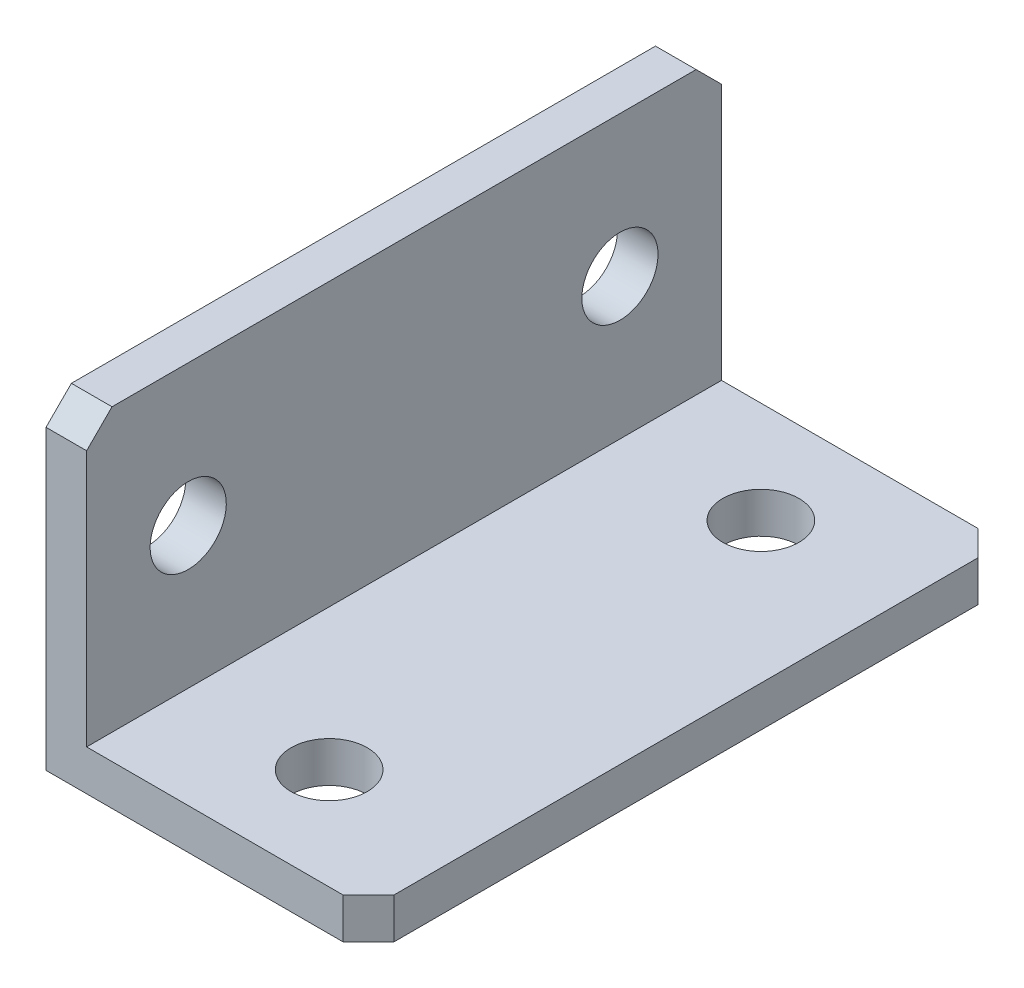
ISO-10303-21;
HEADER;
FILE_DESCRIPTION(('STEP AP214'),'2;1');
FILE_NAME('part.step','',(''),(''),'','','');
FILE_SCHEMA(('AUTOMOTIVE_DESIGN { 1 0 10303 214 1 1 1 1 }'));
ENDSEC;
DATA;
#1=APPLICATION_CONTEXT('core data for automotive mechanical design processes');
#2=APPLICATION_PROTOCOL_DEFINITION('international standard','automotive_design',2000,#1);
#3=PRODUCT_CONTEXT('',#1,'mechanical');
#4=PRODUCT('Part','Part','',(#3));
#5=PRODUCT_RELATED_PRODUCT_CATEGORY('part','',(#4));
#6=PRODUCT_DEFINITION_FORMATION('','',#4);
#7=PRODUCT_DEFINITION_CONTEXT('part definition',#1,'design');
#8=PRODUCT_DEFINITION('design','',#6,#7);
#9=PRODUCT_DEFINITION_SHAPE('','',#8);
#10=(LENGTH_UNIT() NAMED_UNIT(*) SI_UNIT(.MILLI.,.METRE.));
#11=(NAMED_UNIT(*) PLANE_ANGLE_UNIT() SI_UNIT($,.RADIAN.));
#12=(NAMED_UNIT(*) SI_UNIT($,.STERADIAN.) SOLID_ANGLE_UNIT());
#13=UNCERTAINTY_MEASURE_WITH_UNIT(LENGTH_MEASURE(1.E-05),#10,'distance_accuracy_value','');
#14=(GEOMETRIC_REPRESENTATION_CONTEXT(3) GLOBAL_UNCERTAINTY_ASSIGNED_CONTEXT((#13)) GLOBAL_UNIT_ASSIGNED_CONTEXT((#10,
#11,#12)) REPRESENTATION_CONTEXT('',''));
#15=CARTESIAN_POINT('',(0.,0.,0.));
#16=DIRECTION('',(0.,0.,1.));
#17=DIRECTION('',(1.,0.,0.));
#18=AXIS2_PLACEMENT_3D('',#15,#16,#17);
#19=CARTESIAN_POINT('',(22.2,0.,50.));
#20=DIRECTION('',(0.,-1.,0.));
#21=DIRECTION('',(1.,0.,0.));
#22=AXIS2_PLACEMENT_3D('',#19,#20,#21);
#23=PLANE('',#22);
#24=CARTESIAN_POINT('',(11.1,0.,8.));
#25=DIRECTION('',(0.,1.,0.));
#26=DIRECTION('',(-1.,0.,0.));
#27=AXIS2_PLACEMENT_3D('',#24,#25,#26);
#28=CIRCLE('',#27,3.);
#29=CARTESIAN_POINT('',(8.1,0.,8.));
#30=VERTEX_POINT('',#29);
#31=EDGE_CURVE('E333',#30,#30,#28,.T.);
#32=ORIENTED_EDGE('',*,*,#31,.F.);
#33=EDGE_LOOP('',(#32));
#34=FACE_BOUND('',#33,.T.);
#35=CARTESIAN_POINT('',(11.1,0.,42.));
#36=DIRECTION('',(0.,1.,0.));
#37=DIRECTION('',(-1.,0.,0.));
#38=AXIS2_PLACEMENT_3D('',#35,#36,#37);
#39=CIRCLE('',#38,3.);
#40=CARTESIAN_POINT('',(8.1,0.,42.));
#41=VERTEX_POINT('',#40);
#42=EDGE_CURVE('E337',#41,#41,#39,.T.);
#43=ORIENTED_EDGE('',*,*,#42,.F.);
#44=EDGE_LOOP('',(#43));
#45=FACE_BOUND('',#44,.T.);
#46=DIRECTION('',(0.,0.,-1.));
#47=VECTOR('',#46,1.);
#48=CARTESIAN_POINT('',(22.2,0.,50.));
#49=LINE('',#48,#47);
#50=CARTESIAN_POINT('',(22.2,0.,48.));
#51=VERTEX_POINT('',#50);
#52=CARTESIAN_POINT('',(22.2,0.,2.00000000000001));
#53=VERTEX_POINT('',#52);
#54=EDGE_CURVE('E214',#51,#53,#49,.T.);
#55=ORIENTED_EDGE('',*,*,#54,.T.);
#56=DIRECTION('',(-0.707106781186548,0.,-0.707106781186548));
#57=VECTOR('',#56,1.);
#58=CARTESIAN_POINT('',(22.2,0.,2.00000000000001));
#59=LINE('',#58,#57);
#60=CARTESIAN_POINT('',(20.2,0.,0.));
#61=VERTEX_POINT('',#60);
#62=EDGE_CURVE('E201',#53,#61,#59,.T.);
#63=ORIENTED_EDGE('',*,*,#62,.T.);
#64=DIRECTION('',(-1.,0.,0.));
#65=VECTOR('',#64,1.);
#66=CARTESIAN_POINT('',(22.2,0.,0.));
#67=LINE('',#66,#65);
#68=CARTESIAN_POINT('',(0.,0.,0.));
#69=VERTEX_POINT('',#68);
#70=EDGE_CURVE('E152',#61,#69,#67,.T.);
#71=ORIENTED_EDGE('',*,*,#70,.T.);
#72=DIRECTION('',(0.,0.,-1.));
#73=VECTOR('',#72,1.);
#74=CARTESIAN_POINT('',(0.,0.,50.));
#75=LINE('',#74,#73);
#76=CARTESIAN_POINT('',(0.,0.,50.));
#77=VERTEX_POINT('',#76);
#78=EDGE_CURVE('E143',#77,#69,#75,.T.);
#79=ORIENTED_EDGE('',*,*,#78,.F.);
#80=DIRECTION('',(-1.,0.,0.));
#81=VECTOR('',#80,1.);
#82=CARTESIAN_POINT('',(22.2,0.,50.));
#83=LINE('',#82,#81);
#84=CARTESIAN_POINT('',(20.2,0.,50.));
#85=VERTEX_POINT('',#84);
#86=EDGE_CURVE('E125',#85,#77,#83,.T.);
#87=ORIENTED_EDGE('',*,*,#86,.F.);
#88=DIRECTION('',(-0.707106781186548,0.,0.707106781186548));
#89=VECTOR('',#88,1.);
#90=CARTESIAN_POINT('',(20.2,0.,50.));
#91=LINE('',#90,#89);
#92=EDGE_CURVE('E198',#85,#51,#91,.F.);
#93=ORIENTED_EDGE('',*,*,#92,.T.);
#94=EDGE_LOOP('',(#55,#63,#71,#79,#87,#93));
#95=FACE_BOUND('',#94,.T.);
#96=ADVANCED_FACE('F45',(#34,#45,#95),#23,.F.);
#97=CARTESIAN_POINT('',(0.,0.,50.));
#98=DIRECTION('',(-1.,0.,0.));
#99=DIRECTION('',(0.,-1.,0.));
#100=AXIS2_PLACEMENT_3D('',#97,#98,#99);
#101=PLANE('',#100);
#102=CARTESIAN_POINT('',(0.,11.1,42.));
#103=DIRECTION('',(1.,0.,0.));
#104=DIRECTION('',(0.,1.,0.));
#105=AXIS2_PLACEMENT_3D('',#102,#103,#104);
#106=CIRCLE('',#105,3.);
#107=CARTESIAN_POINT('',(0.,14.1,42.));
#108=VERTEX_POINT('',#107);
#109=EDGE_CURVE('E315',#108,#108,#106,.T.);
#110=ORIENTED_EDGE('',*,*,#109,.F.);
#111=EDGE_LOOP('',(#110));
#112=FACE_BOUND('',#111,.T.);
#113=CARTESIAN_POINT('',(0.,11.1,8.));
#114=DIRECTION('',(1.,0.,0.));
#115=DIRECTION('',(0.,1.,0.));
#116=AXIS2_PLACEMENT_3D('',#113,#114,#115);
#117=CIRCLE('',#116,3.);
#118=CARTESIAN_POINT('',(0.,14.1,8.));
#119=VERTEX_POINT('',#118);
#120=EDGE_CURVE('E317',#119,#119,#117,.T.);
#121=ORIENTED_EDGE('',*,*,#120,.F.);
#122=EDGE_LOOP('',(#121));
#123=FACE_BOUND('',#122,.T.);
#124=DIRECTION('',(0.,1.,0.));
#125=VECTOR('',#124,1.);
#126=CARTESIAN_POINT('',(0.,0.,0.));
#127=LINE('',#126,#125);
#128=CARTESIAN_POINT('',(0.,20.2,0.));
#129=VERTEX_POINT('',#128);
#130=EDGE_CURVE('E244',#69,#129,#127,.T.);
#131=ORIENTED_EDGE('',*,*,#130,.T.);
#132=DIRECTION('',(0.,0.707106781186548,0.707106781186548));
#133=VECTOR('',#132,1.);
#134=CARTESIAN_POINT('',(0.,22.2,2.00000000000001));
#135=LINE('',#134,#133);
#136=CARTESIAN_POINT('',(0.,22.2,2.00000000000001));
#137=VERTEX_POINT('',#136);
#138=EDGE_CURVE('E184',#129,#137,#135,.T.);
#139=ORIENTED_EDGE('',*,*,#138,.T.);
#140=DIRECTION('',(0.,0.,-1.));
#141=VECTOR('',#140,1.);
#142=CARTESIAN_POINT('',(0.,22.2,50.));
#143=LINE('',#142,#141);
#144=CARTESIAN_POINT('',(0.,22.2,48.));
#145=VERTEX_POINT('',#144);
#146=EDGE_CURVE('E156',#145,#137,#143,.T.);
#147=ORIENTED_EDGE('',*,*,#146,.F.);
#148=DIRECTION('',(0.,0.707106781186548,-0.707106781186548));
#149=VECTOR('',#148,1.);
#150=CARTESIAN_POINT('',(0.,20.2,50.));
#151=LINE('',#150,#149);
#152=CARTESIAN_POINT('',(0.,20.2,50.));
#153=VERTEX_POINT('',#152);
#154=EDGE_CURVE('E146',#145,#153,#151,.F.);
#155=ORIENTED_EDGE('',*,*,#154,.T.);
#156=DIRECTION('',(0.,1.,0.));
#157=VECTOR('',#156,1.);
#158=CARTESIAN_POINT('',(0.,0.,50.));
#159=LINE('',#158,#157);
#160=EDGE_CURVE('E129',#77,#153,#159,.T.);
#161=ORIENTED_EDGE('',*,*,#160,.F.);
#162=ORIENTED_EDGE('',*,*,#78,.T.);
#163=EDGE_LOOP('',(#131,#139,#147,#155,#161,#162));
#164=FACE_BOUND('',#163,.T.);
#165=ADVANCED_FACE('F142',(#112,#123,#164),#101,.F.);
#166=CARTESIAN_POINT('',(0.,22.2,50.));
#167=DIRECTION('',(0.,-1.,0.));
#168=DIRECTION('',(0.,0.,-1.));
#169=AXIS2_PLACEMENT_3D('',#166,#167,#168);
#170=PLANE('',#169);
#171=ORIENTED_EDGE('',*,*,#146,.T.);
#172=DIRECTION('',(-1.,0.,0.));
#173=VECTOR('',#172,1.);
#174=CARTESIAN_POINT('',(-3.2,22.2,2.00000000000001));
#175=LINE('',#174,#173);
#176=CARTESIAN_POINT('',(-3.2,22.2,2.00000000000001));
#177=VERTEX_POINT('',#176);
#178=EDGE_CURVE('E160',#137,#177,#175,.T.);
#179=ORIENTED_EDGE('',*,*,#178,.T.);
#180=DIRECTION('',(0.,0.,-1.));
#181=VECTOR('',#180,1.);
#182=CARTESIAN_POINT('',(-3.2,22.2,50.));
#183=LINE('',#182,#181);
#184=CARTESIAN_POINT('',(-3.2,22.2,48.));
#185=VERTEX_POINT('',#184);
#186=EDGE_CURVE('E163',#185,#177,#183,.T.);
#187=ORIENTED_EDGE('',*,*,#186,.F.);
#188=DIRECTION('',(1.,0.,0.));
#189=VECTOR('',#188,1.);
#190=CARTESIAN_POINT('',(0.,22.2,48.));
#191=LINE('',#190,#189);
#192=EDGE_CURVE('E155',#185,#145,#191,.T.);
#193=ORIENTED_EDGE('',*,*,#192,.T.);
#194=EDGE_LOOP('',(#171,#179,#187,#193));
#195=FACE_BOUND('',#194,.T.);
#196=ADVANCED_FACE('F235',(#195),#170,.F.);
#197=CARTESIAN_POINT('',(-3.2,22.2,50.));
#198=DIRECTION('',(1.,0.,0.));
#199=DIRECTION('',(0.,1.,0.));
#200=AXIS2_PLACEMENT_3D('',#197,#198,#199);
#201=PLANE('',#200);
#202=CARTESIAN_POINT('',(-3.2,11.1,42.));
#203=DIRECTION('',(1.,0.,0.));
#204=DIRECTION('',(0.,1.,0.));
#205=AXIS2_PLACEMENT_3D('',#202,#203,#204);
#206=CIRCLE('',#205,3.);
#207=CARTESIAN_POINT('',(-3.2,14.1,42.));
#208=VERTEX_POINT('',#207);
#209=EDGE_CURVE('E312',#208,#208,#206,.T.);
#210=ORIENTED_EDGE('',*,*,#209,.T.);
#211=EDGE_LOOP('',(#210));
#212=FACE_BOUND('',#211,.T.);
#213=CARTESIAN_POINT('',(-3.2,11.1,8.));
#214=DIRECTION('',(1.,0.,0.));
#215=DIRECTION('',(0.,1.,0.));
#216=AXIS2_PLACEMENT_3D('',#213,#214,#215);
#217=CIRCLE('',#216,3.);
#218=CARTESIAN_POINT('',(-3.2,14.1,8.));
#219=VERTEX_POINT('',#218);
#220=EDGE_CURVE('E324',#219,#219,#217,.T.);
#221=ORIENTED_EDGE('',*,*,#220,.T.);
#222=EDGE_LOOP('',(#221));
#223=FACE_BOUND('',#222,.T.);
#224=ORIENTED_EDGE('',*,*,#186,.T.);
#225=DIRECTION('',(0.,-0.707106781186548,-0.707106781186548));
#226=VECTOR('',#225,1.);
#227=CARTESIAN_POINT('',(-3.2,22.2,2.00000000000001));
#228=LINE('',#227,#226);
#229=CARTESIAN_POINT('',(-3.2,20.2,0.));
#230=VERTEX_POINT('',#229);
#231=EDGE_CURVE('E173',#177,#230,#228,.T.);
#232=ORIENTED_EDGE('',*,*,#231,.T.);
#233=DIRECTION('',(0.,-1.,0.));
#234=VECTOR('',#233,1.);
#235=CARTESIAN_POINT('',(-3.2,22.2,0.));
#236=LINE('',#235,#234);
#237=CARTESIAN_POINT('',(-3.2,-3.2,0.));
#238=VERTEX_POINT('',#237);
#239=EDGE_CURVE('E247',#230,#238,#236,.T.);
#240=ORIENTED_EDGE('',*,*,#239,.T.);
#241=DIRECTION('',(0.,0.,-1.));
#242=VECTOR('',#241,1.);
#243=CARTESIAN_POINT('',(-3.2,-3.2,50.));
#244=LINE('',#243,#242);
#245=CARTESIAN_POINT('',(-3.2,-3.2,50.));
#246=VERTEX_POINT('',#245);
#247=EDGE_CURVE('E221',#246,#238,#244,.T.);
#248=ORIENTED_EDGE('',*,*,#247,.F.);
#249=DIRECTION('',(0.,-1.,0.));
#250=VECTOR('',#249,1.);
#251=CARTESIAN_POINT('',(-3.2,22.2,50.));
#252=LINE('',#251,#250);
#253=CARTESIAN_POINT('',(-3.2,20.2,50.));
#254=VERTEX_POINT('',#253);
#255=EDGE_CURVE('E148',#254,#246,#252,.T.);
#256=ORIENTED_EDGE('',*,*,#255,.F.);
#257=DIRECTION('',(0.,-0.707106781186548,0.707106781186548));
#258=VECTOR('',#257,1.);
#259=CARTESIAN_POINT('',(-3.2,20.2,50.));
#260=LINE('',#259,#258);
#261=EDGE_CURVE('E170',#254,#185,#260,.F.);
#262=ORIENTED_EDGE('',*,*,#261,.T.);
#263=EDGE_LOOP('',(#224,#232,#240,#248,#256,#262));
#264=FACE_BOUND('',#263,.T.);
#265=ADVANCED_FACE('F231',(#212,#223,#264),#201,.F.);
#266=CARTESIAN_POINT('',(-3.2,-3.2,50.));
#267=DIRECTION('',(0.,1.,0.));
#268=DIRECTION('',(-1.,0.,0.));
#269=AXIS2_PLACEMENT_3D('',#266,#267,#268);
#270=PLANE('',#269);
#271=CARTESIAN_POINT('',(11.1,-3.2,8.));
#272=DIRECTION('',(0.,1.,0.));
#273=DIRECTION('',(-1.,0.,0.));
#274=AXIS2_PLACEMENT_3D('',#271,#272,#273);
#275=CIRCLE('',#274,3.);
#276=CARTESIAN_POINT('',(8.1,-3.2,8.));
#277=VERTEX_POINT('',#276);
#278=EDGE_CURVE('E245',#277,#277,#275,.T.);
#279=ORIENTED_EDGE('',*,*,#278,.T.);
#280=EDGE_LOOP('',(#279));
#281=FACE_BOUND('',#280,.T.);
#282=CARTESIAN_POINT('',(11.1,-3.2,42.));
#283=DIRECTION('',(0.,1.,0.));
#284=DIRECTION('',(-1.,0.,0.));
#285=AXIS2_PLACEMENT_3D('',#282,#283,#284);
#286=CIRCLE('',#285,3.);
#287=CARTESIAN_POINT('',(8.1,-3.2,42.));
#288=VERTEX_POINT('',#287);
#289=EDGE_CURVE('E321',#288,#288,#286,.T.);
#290=ORIENTED_EDGE('',*,*,#289,.T.);
#291=EDGE_LOOP('',(#290));
#292=FACE_BOUND('',#291,.T.);
#293=DIRECTION('',(1.,0.,0.));
#294=VECTOR('',#293,1.);
#295=CARTESIAN_POINT('',(-3.2,-3.2,0.));
#296=LINE('',#295,#294);
#297=CARTESIAN_POINT('',(20.2,-3.2,0.));
#298=VERTEX_POINT('',#297);
#299=EDGE_CURVE('E137',#238,#298,#296,.T.);
#300=ORIENTED_EDGE('',*,*,#299,.T.);
#301=DIRECTION('',(0.707106781186548,0.,0.707106781186548));
#302=VECTOR('',#301,1.);
#303=CARTESIAN_POINT('',(22.2,-3.2,2.00000000000001));
#304=LINE('',#303,#302);
#305=CARTESIAN_POINT('',(22.2,-3.2,2.00000000000001));
#306=VERTEX_POINT('',#305);
#307=EDGE_CURVE('E11',#298,#306,#304,.T.);
#308=ORIENTED_EDGE('',*,*,#307,.T.);
#309=DIRECTION('',(0.,0.,-1.));
#310=VECTOR('',#309,1.);
#311=CARTESIAN_POINT('',(22.2,-3.2,50.));
#312=LINE('',#311,#310);
#313=CARTESIAN_POINT('',(22.2,-3.2,48.));
#314=VERTEX_POINT('',#313);
#315=EDGE_CURVE('E209',#314,#306,#312,.T.);
#316=ORIENTED_EDGE('',*,*,#315,.F.);
#317=DIRECTION('',(0.707106781186548,0.,-0.707106781186548));
#318=VECTOR('',#317,1.);
#319=CARTESIAN_POINT('',(20.2,-3.2,50.));
#320=LINE('',#319,#318);
#321=CARTESIAN_POINT('',(20.2,-3.2,50.));
#322=VERTEX_POINT('',#321);
#323=EDGE_CURVE('E55',#314,#322,#320,.F.);
#324=ORIENTED_EDGE('',*,*,#323,.T.);
#325=DIRECTION('',(1.,0.,0.));
#326=VECTOR('',#325,1.);
#327=CARTESIAN_POINT('',(-3.2,-3.2,50.));
#328=LINE('',#327,#326);
#329=EDGE_CURVE('E208',#246,#322,#328,.T.);
#330=ORIENTED_EDGE('',*,*,#329,.F.);
#331=ORIENTED_EDGE('',*,*,#247,.T.);
#332=EDGE_LOOP('',(#300,#308,#316,#324,#330,#331));
#333=FACE_BOUND('',#332,.T.);
#334=ADVANCED_FACE('F206',(#281,#292,#333),#270,.F.);
#335=CARTESIAN_POINT('',(22.2,-3.2,50.));
#336=DIRECTION('',(-1.,0.,0.));
#337=DIRECTION('',(0.,0.,1.));
#338=AXIS2_PLACEMENT_3D('',#335,#336,#337);
#339=PLANE('',#338);
#340=ORIENTED_EDGE('',*,*,#315,.T.);
#341=DIRECTION('',(0.,1.,0.));
#342=VECTOR('',#341,1.);
#343=CARTESIAN_POINT('',(22.2,0.,2.00000000000001));
#344=LINE('',#343,#342);
#345=EDGE_CURVE('E194',#306,#53,#344,.T.);
#346=ORIENTED_EDGE('',*,*,#345,.T.);
#347=ORIENTED_EDGE('',*,*,#54,.F.);
#348=DIRECTION('',(0.,-1.,0.));
#349=VECTOR('',#348,1.);
#350=CARTESIAN_POINT('',(22.2,-3.2,48.));
#351=LINE('',#350,#349);
#352=EDGE_CURVE('E67',#51,#314,#351,.T.);
#353=ORIENTED_EDGE('',*,*,#352,.T.);
#354=EDGE_LOOP('',(#340,#346,#347,#353));
#355=FACE_BOUND('',#354,.T.);
#356=ADVANCED_FACE('F216',(#355),#339,.F.);
#357=CARTESIAN_POINT('',(0.,0.,50.));
#358=DIRECTION('',(0.,0.,-1.));
#359=DIRECTION('',(-1.,0.,0.));
#360=AXIS2_PLACEMENT_3D('',#357,#358,#359);
#361=PLANE('',#360);
#362=ORIENTED_EDGE('',*,*,#160,.T.);
#363=DIRECTION('',(-1.,0.,0.));
#364=VECTOR('',#363,1.);
#365=CARTESIAN_POINT('',(0.,20.2,50.));
#366=LINE('',#365,#364);
#367=EDGE_CURVE('E189',#153,#254,#366,.T.);
#368=ORIENTED_EDGE('',*,*,#367,.T.);
#369=ORIENTED_EDGE('',*,*,#255,.T.);
#370=ORIENTED_EDGE('',*,*,#329,.T.);
#371=DIRECTION('',(0.,1.,0.));
#372=VECTOR('',#371,1.);
#373=CARTESIAN_POINT('',(20.2,0.,50.));
#374=LINE('',#373,#372);
#375=EDGE_CURVE('E133',#322,#85,#374,.T.);
#376=ORIENTED_EDGE('',*,*,#375,.T.);
#377=ORIENTED_EDGE('',*,*,#86,.T.);
#378=EDGE_LOOP('',(#362,#368,#369,#370,#376,#377));
#379=FACE_BOUND('',#378,.T.);
#380=ADVANCED_FACE('F127',(#379),#361,.F.);
#381=CARTESIAN_POINT('',(0.,0.,0.));
#382=DIRECTION('',(0.,0.,-1.));
#383=DIRECTION('',(-1.,0.,0.));
#384=AXIS2_PLACEMENT_3D('',#381,#382,#383);
#385=PLANE('',#384);
#386=ORIENTED_EDGE('',*,*,#239,.F.);
#387=DIRECTION('',(1.,0.,0.));
#388=VECTOR('',#387,1.);
#389=CARTESIAN_POINT('',(0.,20.2,0.));
#390=LINE('',#389,#388);
#391=EDGE_CURVE('E179',#230,#129,#390,.T.);
#392=ORIENTED_EDGE('',*,*,#391,.T.);
#393=ORIENTED_EDGE('',*,*,#130,.F.);
#394=ORIENTED_EDGE('',*,*,#70,.F.);
#395=DIRECTION('',(0.,-1.,0.));
#396=VECTOR('',#395,1.);
#397=CARTESIAN_POINT('',(20.2,-3.2,0.));
#398=LINE('',#397,#396);
#399=EDGE_CURVE('E176',#61,#298,#398,.T.);
#400=ORIENTED_EDGE('',*,*,#399,.T.);
#401=ORIENTED_EDGE('',*,*,#299,.F.);
#402=EDGE_LOOP('',(#386,#392,#393,#394,#400,#401));
#403=FACE_BOUND('',#402,.T.);
#404=ADVANCED_FACE('F255',(#403),#385,.T.);
#405=CARTESIAN_POINT('',(0.,22.2,2.00000000000001));
#406=DIRECTION('',(0.,0.707106781186548,-0.707106781186548));
#407=DIRECTION('',(1.,0.,0.));
#408=AXIS2_PLACEMENT_3D('',#405,#406,#407);
#409=PLANE('',#408);
#410=ORIENTED_EDGE('',*,*,#138,.F.);
#411=ORIENTED_EDGE('',*,*,#391,.F.);
#412=ORIENTED_EDGE('',*,*,#231,.F.);
#413=ORIENTED_EDGE('',*,*,#178,.F.);
#414=EDGE_LOOP('',(#410,#411,#412,#413));
#415=FACE_BOUND('',#414,.T.);
#416=ADVANCED_FACE('F259',(#415),#409,.T.);
#417=CARTESIAN_POINT('',(0.,20.2,50.));
#418=DIRECTION('',(0.,-0.707106781186547,-0.707106781186547));
#419=DIRECTION('',(-1.,0.,0.));
#420=AXIS2_PLACEMENT_3D('',#417,#418,#419);
#421=PLANE('',#420);
#422=ORIENTED_EDGE('',*,*,#154,.F.);
#423=ORIENTED_EDGE('',*,*,#192,.F.);
#424=ORIENTED_EDGE('',*,*,#261,.F.);
#425=ORIENTED_EDGE('',*,*,#367,.F.);
#426=EDGE_LOOP('',(#422,#423,#424,#425));
#427=FACE_BOUND('',#426,.T.);
#428=ADVANCED_FACE('F238',(#427),#421,.F.);
#429=CARTESIAN_POINT('',(22.2,-3.2,2.00000000000001));
#430=DIRECTION('',(0.707106781186548,0.,-0.707106781186548));
#431=DIRECTION('',(0.,-1.,0.));
#432=AXIS2_PLACEMENT_3D('',#429,#430,#431);
#433=PLANE('',#432);
#434=ORIENTED_EDGE('',*,*,#307,.F.);
#435=ORIENTED_EDGE('',*,*,#399,.F.);
#436=ORIENTED_EDGE('',*,*,#62,.F.);
#437=ORIENTED_EDGE('',*,*,#345,.F.);
#438=EDGE_LOOP('',(#434,#435,#436,#437));
#439=FACE_BOUND('',#438,.T.);
#440=ADVANCED_FACE('F254',(#439),#433,.T.);
#441=CARTESIAN_POINT('',(20.2,0.,50.));
#442=DIRECTION('',(-0.707106781186547,0.,-0.707106781186547));
#443=DIRECTION('',(0.,1.,0.));
#444=AXIS2_PLACEMENT_3D('',#441,#442,#443);
#445=PLANE('',#444);
#446=ORIENTED_EDGE('',*,*,#323,.F.);
#447=ORIENTED_EDGE('',*,*,#352,.F.);
#448=ORIENTED_EDGE('',*,*,#92,.F.);
#449=ORIENTED_EDGE('',*,*,#375,.F.);
#450=EDGE_LOOP('',(#446,#447,#448,#449));
#451=FACE_BOUND('',#450,.T.);
#452=ADVANCED_FACE('F48',(#451),#445,.F.);
#453=CARTESIAN_POINT('',(11.1,-3.2,42.));
#454=DIRECTION('',(0.,1.,0.));
#455=DIRECTION('',(-1.,0.,0.));
#456=AXIS2_PLACEMENT_3D('',#453,#454,#455);
#457=CYLINDRICAL_SURFACE('',#456,3.);
#458=ORIENTED_EDGE('',*,*,#289,.F.);
#459=EDGE_LOOP('',(#458));
#460=FACE_BOUND('',#459,.T.);
#461=ORIENTED_EDGE('',*,*,#42,.T.);
#462=EDGE_LOOP('',(#461));
#463=FACE_BOUND('',#462,.T.);
#464=ADVANCED_FACE('F292',(#460,#463),#457,.F.);
#465=CARTESIAN_POINT('',(11.1,-3.2,8.));
#466=DIRECTION('',(0.,1.,0.));
#467=DIRECTION('',(-1.,0.,0.));
#468=AXIS2_PLACEMENT_3D('',#465,#466,#467);
#469=CYLINDRICAL_SURFACE('',#468,3.);
#470=ORIENTED_EDGE('',*,*,#278,.F.);
#471=EDGE_LOOP('',(#470));
#472=FACE_BOUND('',#471,.T.);
#473=ORIENTED_EDGE('',*,*,#31,.T.);
#474=EDGE_LOOP('',(#473));
#475=FACE_BOUND('',#474,.T.);
#476=ADVANCED_FACE('F295',(#472,#475),#469,.F.);
#477=CARTESIAN_POINT('',(-3.2,11.1,8.));
#478=DIRECTION('',(1.,0.,0.));
#479=DIRECTION('',(0.,1.,0.));
#480=AXIS2_PLACEMENT_3D('',#477,#478,#479);
#481=CYLINDRICAL_SURFACE('',#480,3.);
#482=ORIENTED_EDGE('',*,*,#220,.F.);
#483=EDGE_LOOP('',(#482));
#484=FACE_BOUND('',#483,.T.);
#485=ORIENTED_EDGE('',*,*,#120,.T.);
#486=EDGE_LOOP('',(#485));
#487=FACE_BOUND('',#486,.T.);
#488=ADVANCED_FACE('F299',(#484,#487),#481,.F.);
#489=CARTESIAN_POINT('',(-3.2,11.1,42.));
#490=DIRECTION('',(1.,0.,0.));
#491=DIRECTION('',(0.,1.,0.));
#492=AXIS2_PLACEMENT_3D('',#489,#490,#491);
#493=CYLINDRICAL_SURFACE('',#492,3.);
#494=ORIENTED_EDGE('',*,*,#209,.F.);
#495=EDGE_LOOP('',(#494));
#496=FACE_BOUND('',#495,.T.);
#497=ORIENTED_EDGE('',*,*,#109,.T.);
#498=EDGE_LOOP('',(#497));
#499=FACE_BOUND('',#498,.T.);
#500=ADVANCED_FACE('F303',(#496,#499),#493,.F.);
#501=CLOSED_SHELL('',(#96,#165,#196,#265,#334,#356,#380,#404,#416,#428,#440,#452,#464,#476,#488,#500));
#502=MANIFOLD_SOLID_BREP('B2',#501);
#503=ADVANCED_BREP_SHAPE_REPRESENTATION('',(#18,#502),#14);
#504=SHAPE_DEFINITION_REPRESENTATION(#9,#503);
ENDSEC;
END-ISO-10303-21;
